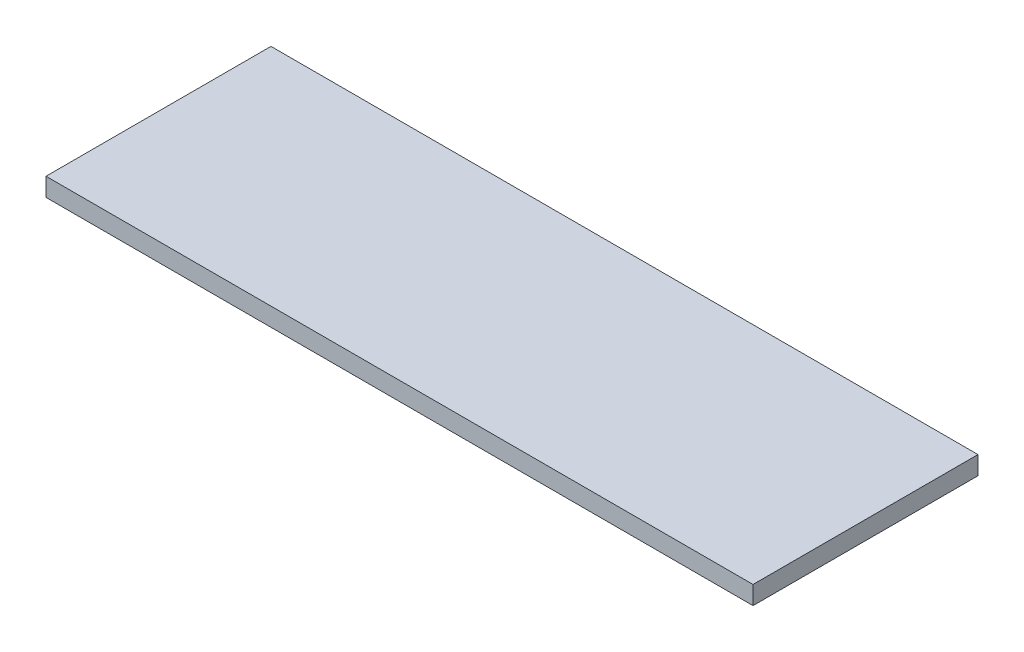
ISO-10303-21;
HEADER;
FILE_DESCRIPTION(('STEP AP214'),'2;1');
FILE_NAME('part.step','',(''),(''),'','','');
FILE_SCHEMA(('AUTOMOTIVE_DESIGN { 1 0 10303 214 1 1 1 1 }'));
ENDSEC;
DATA;
#1=APPLICATION_CONTEXT('core data for automotive mechanical design processes');
#2=APPLICATION_PROTOCOL_DEFINITION('international standard','automotive_design',2000,#1);
#3=PRODUCT_CONTEXT('',#1,'mechanical');
#4=PRODUCT('Part','Part','',(#3));
#5=PRODUCT_RELATED_PRODUCT_CATEGORY('part','',(#4));
#6=PRODUCT_DEFINITION_FORMATION('','',#4);
#7=PRODUCT_DEFINITION_CONTEXT('part definition',#1,'design');
#8=PRODUCT_DEFINITION('design','',#6,#7);
#9=PRODUCT_DEFINITION_SHAPE('','',#8);
#10=(LENGTH_UNIT() NAMED_UNIT(*) SI_UNIT(.MILLI.,.METRE.));
#11=(NAMED_UNIT(*) PLANE_ANGLE_UNIT() SI_UNIT($,.RADIAN.));
#12=(NAMED_UNIT(*) SI_UNIT($,.STERADIAN.) SOLID_ANGLE_UNIT());
#13=UNCERTAINTY_MEASURE_WITH_UNIT(LENGTH_MEASURE(1.E-05),#10,'distance_accuracy_value','');
#14=(GEOMETRIC_REPRESENTATION_CONTEXT(3) GLOBAL_UNCERTAINTY_ASSIGNED_CONTEXT((#13)) GLOBAL_UNIT_ASSIGNED_CONTEXT((#10,
#11,#12)) REPRESENTATION_CONTEXT('',''));
#15=CARTESIAN_POINT('',(0.,0.,0.));
#16=DIRECTION('',(0.,0.,1.));
#17=DIRECTION('',(1.,0.,0.));
#18=AXIS2_PLACEMENT_3D('',#15,#16,#17);
#19=CARTESIAN_POINT('',(-38.5,2.,-12.25));
#20=DIRECTION('',(1.,0.,0.));
#21=DIRECTION('',(0.,0.,-1.));
#22=AXIS2_PLACEMENT_3D('',#19,#20,#21);
#23=PLANE('',#22);
#24=DIRECTION('',(0.,0.,1.));
#25=VECTOR('',#24,1.);
#26=CARTESIAN_POINT('',(-38.5,0.,-12.25));
#27=LINE('',#26,#25);
#28=CARTESIAN_POINT('',(-38.5,0.,-12.25));
#29=VERTEX_POINT('',#28);
#30=CARTESIAN_POINT('',(-38.5,0.,12.25));
#31=VERTEX_POINT('',#30);
#32=EDGE_CURVE('E96',#29,#31,#27,.T.);
#33=ORIENTED_EDGE('',*,*,#32,.T.);
#34=DIRECTION('',(0.,-1.,0.));
#35=VECTOR('',#34,1.);
#36=CARTESIAN_POINT('',(-38.5,2.,12.25));
#37=LINE('',#36,#35);
#38=CARTESIAN_POINT('',(-38.5,2.,12.25));
#39=VERTEX_POINT('',#38);
#40=EDGE_CURVE('E11',#39,#31,#37,.T.);
#41=ORIENTED_EDGE('',*,*,#40,.F.);
#42=DIRECTION('',(0.,0.,1.));
#43=VECTOR('',#42,1.);
#44=CARTESIAN_POINT('',(-38.5,2.,-12.25));
#45=LINE('',#44,#43);
#46=CARTESIAN_POINT('',(-38.5,2.,-12.25));
#47=VERTEX_POINT('',#46);
#48=EDGE_CURVE('E84',#47,#39,#45,.T.);
#49=ORIENTED_EDGE('',*,*,#48,.F.);
#50=DIRECTION('',(0.,-1.,0.));
#51=VECTOR('',#50,1.);
#52=CARTESIAN_POINT('',(-38.5,2.,-12.25));
#53=LINE('',#52,#51);
#54=EDGE_CURVE('E92',#47,#29,#53,.T.);
#55=ORIENTED_EDGE('',*,*,#54,.T.);
#56=EDGE_LOOP('',(#33,#41,#49,#55));
#57=FACE_BOUND('',#56,.T.);
#58=ADVANCED_FACE('F33',(#57),#23,.F.);
#59=CARTESIAN_POINT('',(-38.5,2.,12.25));
#60=DIRECTION('',(0.,0.,-1.));
#61=DIRECTION('',(-1.,0.,0.));
#62=AXIS2_PLACEMENT_3D('',#59,#60,#61);
#63=PLANE('',#62);
#64=DIRECTION('',(1.,0.,0.));
#65=VECTOR('',#64,1.);
#66=CARTESIAN_POINT('',(-38.5,0.,12.25));
#67=LINE('',#66,#65);
#68=CARTESIAN_POINT('',(38.5,0.,12.25));
#69=VERTEX_POINT('',#68);
#70=EDGE_CURVE('E88',#31,#69,#67,.T.);
#71=ORIENTED_EDGE('',*,*,#70,.T.);
#72=DIRECTION('',(0.,-1.,0.));
#73=VECTOR('',#72,1.);
#74=CARTESIAN_POINT('',(38.5,2.,12.25));
#75=LINE('',#74,#73);
#76=CARTESIAN_POINT('',(38.5,2.,12.25));
#77=VERTEX_POINT('',#76);
#78=EDGE_CURVE('E41',#77,#69,#75,.T.);
#79=ORIENTED_EDGE('',*,*,#78,.F.);
#80=DIRECTION('',(1.,0.,0.));
#81=VECTOR('',#80,1.);
#82=CARTESIAN_POINT('',(-38.5,2.,12.25));
#83=LINE('',#82,#81);
#84=EDGE_CURVE('E79',#39,#77,#83,.T.);
#85=ORIENTED_EDGE('',*,*,#84,.F.);
#86=ORIENTED_EDGE('',*,*,#40,.T.);
#87=EDGE_LOOP('',(#71,#79,#85,#86));
#88=FACE_BOUND('',#87,.T.);
#89=ADVANCED_FACE('F87',(#88),#63,.F.);
#90=CARTESIAN_POINT('',(38.5,2.,-12.25));
#91=DIRECTION('',(-1.,0.,0.));
#92=DIRECTION('',(0.,0.,1.));
#93=AXIS2_PLACEMENT_3D('',#90,#91,#92);
#94=PLANE('',#93);
#95=DIRECTION('',(0.,0.,-1.));
#96=VECTOR('',#95,1.);
#97=CARTESIAN_POINT('',(38.5,0.,-12.25));
#98=LINE('',#97,#96);
#99=CARTESIAN_POINT('',(38.5,0.,-12.25));
#100=VERTEX_POINT('',#99);
#101=EDGE_CURVE('E66',#69,#100,#98,.T.);
#102=ORIENTED_EDGE('',*,*,#101,.T.);
#103=DIRECTION('',(0.,-1.,0.));
#104=VECTOR('',#103,1.);
#105=CARTESIAN_POINT('',(38.5,2.,-12.25));
#106=LINE('',#105,#104);
#107=CARTESIAN_POINT('',(38.5,2.,-12.25));
#108=VERTEX_POINT('',#107);
#109=EDGE_CURVE('E89',#108,#100,#106,.T.);
#110=ORIENTED_EDGE('',*,*,#109,.F.);
#111=DIRECTION('',(0.,0.,-1.));
#112=VECTOR('',#111,1.);
#113=CARTESIAN_POINT('',(38.5,2.,-12.25));
#114=LINE('',#113,#112);
#115=EDGE_CURVE('E82',#77,#108,#114,.T.);
#116=ORIENTED_EDGE('',*,*,#115,.F.);
#117=ORIENTED_EDGE('',*,*,#78,.T.);
#118=EDGE_LOOP('',(#102,#110,#116,#117));
#119=FACE_BOUND('',#118,.T.);
#120=ADVANCED_FACE('F90',(#119),#94,.F.);
#121=CARTESIAN_POINT('',(-38.5,2.,-12.25));
#122=DIRECTION('',(0.,0.,1.));
#123=DIRECTION('',(1.,0.,0.));
#124=AXIS2_PLACEMENT_3D('',#121,#122,#123);
#125=PLANE('',#124);
#126=DIRECTION('',(-1.,0.,0.));
#127=VECTOR('',#126,1.);
#128=CARTESIAN_POINT('',(-38.5,0.,-12.25));
#129=LINE('',#128,#127);
#130=EDGE_CURVE('E72',#100,#29,#129,.T.);
#131=ORIENTED_EDGE('',*,*,#130,.T.);
#132=ORIENTED_EDGE('',*,*,#54,.F.);
#133=DIRECTION('',(-1.,0.,0.));
#134=VECTOR('',#133,1.);
#135=CARTESIAN_POINT('',(-38.5,2.,-12.25));
#136=LINE('',#135,#134);
#137=EDGE_CURVE('E49',#108,#47,#136,.T.);
#138=ORIENTED_EDGE('',*,*,#137,.F.);
#139=ORIENTED_EDGE('',*,*,#109,.T.);
#140=EDGE_LOOP('',(#131,#132,#138,#139));
#141=FACE_BOUND('',#140,.T.);
#142=ADVANCED_FACE('F103',(#141),#125,.F.);
#143=CARTESIAN_POINT('',(0.,2.,0.));
#144=DIRECTION('',(0.,1.,0.));
#145=DIRECTION('',(0.,0.,1.));
#146=AXIS2_PLACEMENT_3D('',#143,#144,#145);
#147=PLANE('',#146);
#148=ORIENTED_EDGE('',*,*,#48,.T.);
#149=ORIENTED_EDGE('',*,*,#84,.T.);
#150=ORIENTED_EDGE('',*,*,#115,.T.);
#151=ORIENTED_EDGE('',*,*,#137,.T.);
#152=EDGE_LOOP('',(#148,#149,#150,#151));
#153=FACE_BOUND('',#152,.T.);
#154=ADVANCED_FACE('F80',(#153),#147,.T.);
#155=CARTESIAN_POINT('',(0.,0.,0.));
#156=DIRECTION('',(0.,1.,0.));
#157=DIRECTION('',(0.,0.,1.));
#158=AXIS2_PLACEMENT_3D('',#155,#156,#157);
#159=PLANE('',#158);
#160=ORIENTED_EDGE('',*,*,#32,.F.);
#161=ORIENTED_EDGE('',*,*,#130,.F.);
#162=ORIENTED_EDGE('',*,*,#101,.F.);
#163=ORIENTED_EDGE('',*,*,#70,.F.);
#164=EDGE_LOOP('',(#160,#161,#162,#163));
#165=FACE_BOUND('',#164,.T.);
#166=ADVANCED_FACE('F106',(#165),#159,.F.);
#167=CLOSED_SHELL('',(#58,#89,#120,#142,#154,#166));
#168=MANIFOLD_SOLID_BREP('B2',#167);
#169=ADVANCED_BREP_SHAPE_REPRESENTATION('',(#18,#168),#14);
#170=SHAPE_DEFINITION_REPRESENTATION(#9,#169);
ENDSEC;
END-ISO-10303-21;
